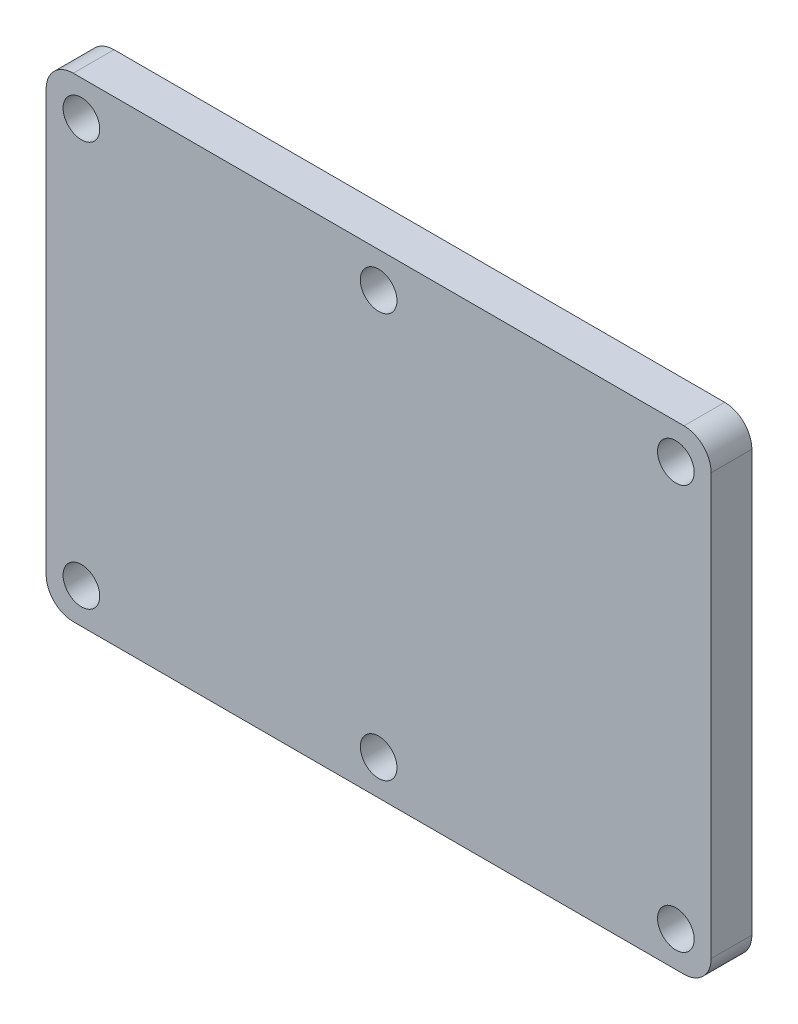
ISO-10303-21;
HEADER;
FILE_DESCRIPTION(('STEP AP214'),'2;1');
FILE_NAME('part.step','',(''),(''),'','','');
FILE_SCHEMA(('AUTOMOTIVE_DESIGN { 1 0 10303 214 1 1 1 1 }'));
ENDSEC;
DATA;
#1=APPLICATION_CONTEXT('core data for automotive mechanical design processes');
#2=APPLICATION_PROTOCOL_DEFINITION('international standard','automotive_design',2000,#1);
#3=PRODUCT_CONTEXT('',#1,'mechanical');
#4=PRODUCT('Part','Part','',(#3));
#5=PRODUCT_RELATED_PRODUCT_CATEGORY('part','',(#4));
#6=PRODUCT_DEFINITION_FORMATION('','',#4);
#7=PRODUCT_DEFINITION_CONTEXT('part definition',#1,'design');
#8=PRODUCT_DEFINITION('design','',#6,#7);
#9=PRODUCT_DEFINITION_SHAPE('','',#8);
#10=(LENGTH_UNIT() NAMED_UNIT(*) SI_UNIT(.MILLI.,.METRE.));
#11=(NAMED_UNIT(*) PLANE_ANGLE_UNIT() SI_UNIT($,.RADIAN.));
#12=(NAMED_UNIT(*) SI_UNIT($,.STERADIAN.) SOLID_ANGLE_UNIT());
#13=UNCERTAINTY_MEASURE_WITH_UNIT(LENGTH_MEASURE(1.E-05),#10,'distance_accuracy_value','');
#14=(GEOMETRIC_REPRESENTATION_CONTEXT(3) GLOBAL_UNCERTAINTY_ASSIGNED_CONTEXT((#13)) GLOBAL_UNIT_ASSIGNED_CONTEXT((#10,
#11,#12)) REPRESENTATION_CONTEXT('',''));
#15=CARTESIAN_POINT('',(0.,0.,0.));
#16=DIRECTION('',(0.,0.,1.));
#17=DIRECTION('',(1.,0.,0.));
#18=AXIS2_PLACEMENT_3D('',#15,#16,#17);
#19=CARTESIAN_POINT('',(0.,0.,0.));
#20=DIRECTION('',(0.,0.,1.));
#21=DIRECTION('',(1.,0.,0.));
#22=AXIS2_PLACEMENT_3D('',#19,#20,#21);
#23=PLANE('',#22);
#24=CARTESIAN_POINT('',(21.9,14.9,0.));
#25=DIRECTION('',(0.,0.,1.));
#26=DIRECTION('',(1.,0.,0.));
#27=AXIS2_PLACEMENT_3D('',#24,#25,#26);
#28=CIRCLE('',#27,1.35);
#29=CARTESIAN_POINT('',(23.25,14.9,0.));
#30=VERTEX_POINT('',#29);
#31=EDGE_CURVE('E265',#30,#30,#28,.T.);
#32=ORIENTED_EDGE('',*,*,#31,.T.);
#33=EDGE_LOOP('',(#32));
#34=FACE_BOUND('',#33,.T.);
#35=CARTESIAN_POINT('',(0.,14.9,0.));
#36=DIRECTION('',(0.,0.,1.));
#37=DIRECTION('',(1.,0.,0.));
#38=AXIS2_PLACEMENT_3D('',#35,#36,#37);
#39=CIRCLE('',#38,1.35);
#40=CARTESIAN_POINT('',(1.35,14.9,0.));
#41=VERTEX_POINT('',#40);
#42=EDGE_CURVE('E301',#41,#41,#39,.T.);
#43=ORIENTED_EDGE('',*,*,#42,.T.);
#44=EDGE_LOOP('',(#43));
#45=FACE_BOUND('',#44,.T.);
#46=CARTESIAN_POINT('',(-21.9,14.9,0.));
#47=DIRECTION('',(0.,0.,1.));
#48=DIRECTION('',(1.,0.,0.));
#49=AXIS2_PLACEMENT_3D('',#46,#47,#48);
#50=CIRCLE('',#49,1.35);
#51=CARTESIAN_POINT('',(-20.55,14.9,0.));
#52=VERTEX_POINT('',#51);
#53=EDGE_CURVE('E293',#52,#52,#50,.T.);
#54=ORIENTED_EDGE('',*,*,#53,.T.);
#55=EDGE_LOOP('',(#54));
#56=FACE_BOUND('',#55,.T.);
#57=CARTESIAN_POINT('',(-21.9,-14.9,0.));
#58=DIRECTION('',(0.,0.,-1.));
#59=DIRECTION('',(-1.,0.,0.));
#60=AXIS2_PLACEMENT_3D('',#57,#58,#59);
#61=CIRCLE('',#60,1.35000000000001);
#62=CARTESIAN_POINT('',(-23.25,-14.9,0.));
#63=VERTEX_POINT('',#62);
#64=EDGE_CURVE('E256',#63,#63,#61,.T.);
#65=ORIENTED_EDGE('',*,*,#64,.F.);
#66=EDGE_LOOP('',(#65));
#67=FACE_BOUND('',#66,.T.);
#68=CARTESIAN_POINT('',(0.,-14.9,0.));
#69=DIRECTION('',(0.,0.,-1.));
#70=DIRECTION('',(-1.,0.,0.));
#71=AXIS2_PLACEMENT_3D('',#68,#69,#70);
#72=CIRCLE('',#71,1.35);
#73=CARTESIAN_POINT('',(-1.35,-14.9,0.));
#74=VERTEX_POINT('',#73);
#75=EDGE_CURVE('E263',#74,#74,#72,.T.);
#76=ORIENTED_EDGE('',*,*,#75,.F.);
#77=EDGE_LOOP('',(#76));
#78=FACE_BOUND('',#77,.T.);
#79=CARTESIAN_POINT('',(21.9,-14.9,0.));
#80=DIRECTION('',(0.,0.,-1.));
#81=DIRECTION('',(-1.,0.,0.));
#82=AXIS2_PLACEMENT_3D('',#79,#80,#81);
#83=CIRCLE('',#82,1.35000000000001);
#84=CARTESIAN_POINT('',(20.55,-14.9,0.));
#85=VERTEX_POINT('',#84);
#86=EDGE_CURVE('E138',#85,#85,#83,.T.);
#87=ORIENTED_EDGE('',*,*,#86,.F.);
#88=EDGE_LOOP('',(#87));
#89=FACE_BOUND('',#88,.T.);
#90=DIRECTION('',(-1.,0.,0.));
#91=VECTOR('',#90,1.);
#92=CARTESIAN_POINT('',(-24.5,17.5,0.));
#93=LINE('',#92,#91);
#94=CARTESIAN_POINT('',(22.5,17.5,0.));
#95=VERTEX_POINT('',#94);
#96=CARTESIAN_POINT('',(-22.5,17.5,0.));
#97=VERTEX_POINT('',#96);
#98=EDGE_CURVE('E259',#95,#97,#93,.T.);
#99=ORIENTED_EDGE('',*,*,#98,.F.);
#100=CARTESIAN_POINT('',(22.5,15.5,0.));
#101=DIRECTION('',(0.,0.,1.));
#102=DIRECTION('',(1.,0.,0.));
#103=AXIS2_PLACEMENT_3D('',#100,#101,#102);
#104=CIRCLE('',#103,2.);
#105=CARTESIAN_POINT('',(24.5,15.5,0.));
#106=VERTEX_POINT('',#105);
#107=EDGE_CURVE('E128',#95,#106,#104,.F.);
#108=ORIENTED_EDGE('',*,*,#107,.T.);
#109=DIRECTION('',(0.,1.,0.));
#110=VECTOR('',#109,1.);
#111=CARTESIAN_POINT('',(24.5,17.5,0.));
#112=LINE('',#111,#110);
#113=CARTESIAN_POINT('',(24.5,-15.5,0.));
#114=VERTEX_POINT('',#113);
#115=EDGE_CURVE('E122',#114,#106,#112,.T.);
#116=ORIENTED_EDGE('',*,*,#115,.F.);
#117=CARTESIAN_POINT('',(22.5,-15.5,0.));
#118=DIRECTION('',(0.,0.,1.));
#119=DIRECTION('',(1.,0.,0.));
#120=AXIS2_PLACEMENT_3D('',#117,#118,#119);
#121=CIRCLE('',#120,2.);
#122=CARTESIAN_POINT('',(22.5,-17.5,0.));
#123=VERTEX_POINT('',#122);
#124=EDGE_CURVE('E107',#114,#123,#121,.F.);
#125=ORIENTED_EDGE('',*,*,#124,.T.);
#126=DIRECTION('',(1.,0.,0.));
#127=VECTOR('',#126,1.);
#128=CARTESIAN_POINT('',(-24.5,-17.5,0.));
#129=LINE('',#128,#127);
#130=CARTESIAN_POINT('',(-22.5,-17.5,0.));
#131=VERTEX_POINT('',#130);
#132=EDGE_CURVE('E135',#131,#123,#129,.T.);
#133=ORIENTED_EDGE('',*,*,#132,.F.);
#134=CARTESIAN_POINT('',(-22.5,-15.5,0.));
#135=DIRECTION('',(0.,0.,1.));
#136=DIRECTION('',(1.,0.,0.));
#137=AXIS2_PLACEMENT_3D('',#134,#135,#136);
#138=CIRCLE('',#137,2.);
#139=CARTESIAN_POINT('',(-24.5,-15.5,0.));
#140=VERTEX_POINT('',#139);
#141=EDGE_CURVE('E119',#131,#140,#138,.F.);
#142=ORIENTED_EDGE('',*,*,#141,.T.);
#143=DIRECTION('',(0.,-1.,0.));
#144=VECTOR('',#143,1.);
#145=CARTESIAN_POINT('',(-24.5,17.5,0.));
#146=LINE('',#145,#144);
#147=CARTESIAN_POINT('',(-24.5,15.5,0.));
#148=VERTEX_POINT('',#147);
#149=EDGE_CURVE('E130',#148,#140,#146,.T.);
#150=ORIENTED_EDGE('',*,*,#149,.F.);
#151=CARTESIAN_POINT('',(-22.5,15.5,0.));
#152=DIRECTION('',(0.,0.,1.));
#153=DIRECTION('',(1.,0.,0.));
#154=AXIS2_PLACEMENT_3D('',#151,#152,#153);
#155=CIRCLE('',#154,2.);
#156=EDGE_CURVE('E170',#148,#97,#155,.F.);
#157=ORIENTED_EDGE('',*,*,#156,.T.);
#158=EDGE_LOOP('',(#99,#108,#116,#125,#133,#142,#150,#157));
#159=FACE_BOUND('',#158,.T.);
#160=ADVANCED_FACE('F38',(#34,#45,#56,#67,#78,#89,#159),#23,.F.);
#161=CARTESIAN_POINT('',(24.5,17.5,3.));
#162=DIRECTION('',(-1.,0.,0.));
#163=DIRECTION('',(0.,0.,1.));
#164=AXIS2_PLACEMENT_3D('',#161,#162,#163);
#165=PLANE('',#164);
#166=ORIENTED_EDGE('',*,*,#115,.T.);
#167=DIRECTION('',(0.,0.,-1.));
#168=VECTOR('',#167,1.);
#169=CARTESIAN_POINT('',(24.5,15.5,3.));
#170=LINE('',#169,#168);
#171=CARTESIAN_POINT('',(24.5,15.5,3.));
#172=VERTEX_POINT('',#171);
#173=EDGE_CURVE('E62',#106,#172,#170,.F.);
#174=ORIENTED_EDGE('',*,*,#173,.T.);
#175=DIRECTION('',(0.,1.,0.));
#176=VECTOR('',#175,1.);
#177=CARTESIAN_POINT('',(24.5,17.5,3.));
#178=LINE('',#177,#176);
#179=CARTESIAN_POINT('',(24.5,-15.5,3.));
#180=VERTEX_POINT('',#179);
#181=EDGE_CURVE('E123',#180,#172,#178,.T.);
#182=ORIENTED_EDGE('',*,*,#181,.F.);
#183=DIRECTION('',(0.,0.,-1.));
#184=VECTOR('',#183,1.);
#185=CARTESIAN_POINT('',(24.5,-15.5,3.));
#186=LINE('',#185,#184);
#187=EDGE_CURVE('E111',#180,#114,#186,.T.);
#188=ORIENTED_EDGE('',*,*,#187,.T.);
#189=EDGE_LOOP('',(#166,#174,#182,#188));
#190=FACE_BOUND('',#189,.T.);
#191=ADVANCED_FACE('F121',(#190),#165,.F.);
#192=CARTESIAN_POINT('',(-24.5,17.5,3.));
#193=DIRECTION('',(0.,-1.,0.));
#194=DIRECTION('',(0.,0.,-1.));
#195=AXIS2_PLACEMENT_3D('',#192,#193,#194);
#196=PLANE('',#195);
#197=DIRECTION('',(-1.,0.,0.));
#198=VECTOR('',#197,1.);
#199=CARTESIAN_POINT('',(-24.5,17.5,3.));
#200=LINE('',#199,#198);
#201=CARTESIAN_POINT('',(22.5,17.5,3.));
#202=VERTEX_POINT('',#201);
#203=CARTESIAN_POINT('',(-22.5,17.5,3.));
#204=VERTEX_POINT('',#203);
#205=EDGE_CURVE('E182',#202,#204,#200,.T.);
#206=ORIENTED_EDGE('',*,*,#205,.F.);
#207=DIRECTION('',(0.,0.,-1.));
#208=VECTOR('',#207,1.);
#209=CARTESIAN_POINT('',(22.5,17.5,3.));
#210=LINE('',#209,#208);
#211=EDGE_CURVE('E166',#202,#95,#210,.T.);
#212=ORIENTED_EDGE('',*,*,#211,.T.);
#213=ORIENTED_EDGE('',*,*,#98,.T.);
#214=DIRECTION('',(0.,0.,-1.));
#215=VECTOR('',#214,1.);
#216=CARTESIAN_POINT('',(-22.5,17.5,3.));
#217=LINE('',#216,#215);
#218=EDGE_CURVE('E163',#97,#204,#217,.F.);
#219=ORIENTED_EDGE('',*,*,#218,.T.);
#220=EDGE_LOOP('',(#206,#212,#213,#219));
#221=FACE_BOUND('',#220,.T.);
#222=ADVANCED_FACE('F186',(#221),#196,.F.);
#223=CARTESIAN_POINT('',(-24.5,17.5,3.));
#224=DIRECTION('',(1.,0.,0.));
#225=DIRECTION('',(0.,0.,-1.));
#226=AXIS2_PLACEMENT_3D('',#223,#224,#225);
#227=PLANE('',#226);
#228=DIRECTION('',(0.,-1.,0.));
#229=VECTOR('',#228,1.);
#230=CARTESIAN_POINT('',(-24.5,17.5,3.));
#231=LINE('',#230,#229);
#232=CARTESIAN_POINT('',(-24.5,15.5,3.));
#233=VERTEX_POINT('',#232);
#234=CARTESIAN_POINT('',(-24.5,-15.5,3.));
#235=VERTEX_POINT('',#234);
#236=EDGE_CURVE('E190',#233,#235,#231,.T.);
#237=ORIENTED_EDGE('',*,*,#236,.F.);
#238=DIRECTION('',(0.,0.,-1.));
#239=VECTOR('',#238,1.);
#240=CARTESIAN_POINT('',(-24.5,15.5,3.));
#241=LINE('',#240,#239);
#242=EDGE_CURVE('E11',#233,#148,#241,.T.);
#243=ORIENTED_EDGE('',*,*,#242,.T.);
#244=ORIENTED_EDGE('',*,*,#149,.T.);
#245=DIRECTION('',(0.,0.,-1.));
#246=VECTOR('',#245,1.);
#247=CARTESIAN_POINT('',(-24.5,-15.5,3.));
#248=LINE('',#247,#246);
#249=EDGE_CURVE('E159',#140,#235,#248,.F.);
#250=ORIENTED_EDGE('',*,*,#249,.T.);
#251=EDGE_LOOP('',(#237,#243,#244,#250));
#252=FACE_BOUND('',#251,.T.);
#253=ADVANCED_FACE('F218',(#252),#227,.F.);
#254=CARTESIAN_POINT('',(-24.5,-17.5,3.));
#255=DIRECTION('',(0.,1.,0.));
#256=DIRECTION('',(0.,0.,1.));
#257=AXIS2_PLACEMENT_3D('',#254,#255,#256);
#258=PLANE('',#257);
#259=ORIENTED_EDGE('',*,*,#132,.T.);
#260=DIRECTION('',(0.,0.,-1.));
#261=VECTOR('',#260,1.);
#262=CARTESIAN_POINT('',(22.5,-17.5,3.));
#263=LINE('',#262,#261);
#264=CARTESIAN_POINT('',(22.5,-17.5,3.));
#265=VERTEX_POINT('',#264);
#266=EDGE_CURVE('E112',#123,#265,#263,.F.);
#267=ORIENTED_EDGE('',*,*,#266,.T.);
#268=DIRECTION('',(1.,0.,0.));
#269=VECTOR('',#268,1.);
#270=CARTESIAN_POINT('',(-24.5,-17.5,3.));
#271=LINE('',#270,#269);
#272=CARTESIAN_POINT('',(-22.5,-17.5,3.));
#273=VERTEX_POINT('',#272);
#274=EDGE_CURVE('E125',#273,#265,#271,.T.);
#275=ORIENTED_EDGE('',*,*,#274,.F.);
#276=DIRECTION('',(0.,0.,-1.));
#277=VECTOR('',#276,1.);
#278=CARTESIAN_POINT('',(-22.5,-17.5,3.));
#279=LINE('',#278,#277);
#280=EDGE_CURVE('E118',#273,#131,#279,.T.);
#281=ORIENTED_EDGE('',*,*,#280,.T.);
#282=EDGE_LOOP('',(#259,#267,#275,#281));
#283=FACE_BOUND('',#282,.T.);
#284=ADVANCED_FACE('F215',(#283),#258,.F.);
#285=CARTESIAN_POINT('',(0.,0.,3.));
#286=DIRECTION('',(0.,0.,1.));
#287=DIRECTION('',(1.,0.,0.));
#288=AXIS2_PLACEMENT_3D('',#285,#286,#287);
#289=PLANE('',#288);
#290=CARTESIAN_POINT('',(21.9,14.9,3.));
#291=DIRECTION('',(0.,0.,1.));
#292=DIRECTION('',(1.,0.,0.));
#293=AXIS2_PLACEMENT_3D('',#290,#291,#292);
#294=CIRCLE('',#293,1.35);
#295=CARTESIAN_POINT('',(23.25,14.9,3.));
#296=VERTEX_POINT('',#295);
#297=EDGE_CURVE('E305',#296,#296,#294,.T.);
#298=ORIENTED_EDGE('',*,*,#297,.F.);
#299=EDGE_LOOP('',(#298));
#300=FACE_BOUND('',#299,.T.);
#301=CARTESIAN_POINT('',(0.,14.9,3.));
#302=DIRECTION('',(0.,0.,1.));
#303=DIRECTION('',(1.,0.,0.));
#304=AXIS2_PLACEMENT_3D('',#301,#302,#303);
#305=CIRCLE('',#304,1.35);
#306=CARTESIAN_POINT('',(1.35,14.9,3.));
#307=VERTEX_POINT('',#306);
#308=EDGE_CURVE('E297',#307,#307,#305,.T.);
#309=ORIENTED_EDGE('',*,*,#308,.F.);
#310=EDGE_LOOP('',(#309));
#311=FACE_BOUND('',#310,.T.);
#312=CARTESIAN_POINT('',(-21.9,14.9,3.));
#313=DIRECTION('',(0.,0.,1.));
#314=DIRECTION('',(1.,0.,0.));
#315=AXIS2_PLACEMENT_3D('',#312,#313,#314);
#316=CIRCLE('',#315,1.35);
#317=CARTESIAN_POINT('',(-20.55,14.9,3.));
#318=VERTEX_POINT('',#317);
#319=EDGE_CURVE('E289',#318,#318,#316,.T.);
#320=ORIENTED_EDGE('',*,*,#319,.F.);
#321=EDGE_LOOP('',(#320));
#322=FACE_BOUND('',#321,.T.);
#323=CARTESIAN_POINT('',(21.9,-14.9,3.));
#324=DIRECTION('',(0.,0.,-1.));
#325=DIRECTION('',(-1.,0.,0.));
#326=AXIS2_PLACEMENT_3D('',#323,#324,#325);
#327=CIRCLE('',#326,1.35000000000001);
#328=CARTESIAN_POINT('',(20.55,-14.9,3.));
#329=VERTEX_POINT('',#328);
#330=EDGE_CURVE('E131',#329,#329,#327,.T.);
#331=ORIENTED_EDGE('',*,*,#330,.T.);
#332=EDGE_LOOP('',(#331));
#333=FACE_BOUND('',#332,.T.);
#334=CARTESIAN_POINT('',(0.,-14.9,3.));
#335=DIRECTION('',(0.,0.,-1.));
#336=DIRECTION('',(-1.,0.,0.));
#337=AXIS2_PLACEMENT_3D('',#334,#335,#336);
#338=CIRCLE('',#337,1.35);
#339=CARTESIAN_POINT('',(-1.35,-14.9,3.));
#340=VERTEX_POINT('',#339);
#341=EDGE_CURVE('E282',#340,#340,#338,.T.);
#342=ORIENTED_EDGE('',*,*,#341,.T.);
#343=EDGE_LOOP('',(#342));
#344=FACE_BOUND('',#343,.T.);
#345=CARTESIAN_POINT('',(-21.9,-14.9,3.));
#346=DIRECTION('',(0.,0.,-1.));
#347=DIRECTION('',(-1.,0.,0.));
#348=AXIS2_PLACEMENT_3D('',#345,#346,#347);
#349=CIRCLE('',#348,1.35000000000001);
#350=CARTESIAN_POINT('',(-23.25,-14.9,3.));
#351=VERTEX_POINT('',#350);
#352=EDGE_CURVE('E253',#351,#351,#349,.T.);
#353=ORIENTED_EDGE('',*,*,#352,.T.);
#354=EDGE_LOOP('',(#353));
#355=FACE_BOUND('',#354,.T.);
#356=ORIENTED_EDGE('',*,*,#181,.T.);
#357=CARTESIAN_POINT('',(22.5,15.5,3.));
#358=DIRECTION('',(0.,0.,1.));
#359=DIRECTION('',(1.,0.,0.));
#360=AXIS2_PLACEMENT_3D('',#357,#358,#359);
#361=CIRCLE('',#360,2.);
#362=EDGE_CURVE('E47',#172,#202,#361,.T.);
#363=ORIENTED_EDGE('',*,*,#362,.T.);
#364=ORIENTED_EDGE('',*,*,#205,.T.);
#365=CARTESIAN_POINT('',(-22.5,15.5,3.));
#366=DIRECTION('',(0.,0.,1.));
#367=DIRECTION('',(1.,0.,0.));
#368=AXIS2_PLACEMENT_3D('',#365,#366,#367);
#369=CIRCLE('',#368,2.);
#370=EDGE_CURVE('E54',#204,#233,#369,.T.);
#371=ORIENTED_EDGE('',*,*,#370,.T.);
#372=ORIENTED_EDGE('',*,*,#236,.T.);
#373=CARTESIAN_POINT('',(-22.5,-15.5,3.));
#374=DIRECTION('',(0.,0.,1.));
#375=DIRECTION('',(1.,0.,0.));
#376=AXIS2_PLACEMENT_3D('',#373,#374,#375);
#377=CIRCLE('',#376,2.);
#378=EDGE_CURVE('E153',#235,#273,#377,.T.);
#379=ORIENTED_EDGE('',*,*,#378,.T.);
#380=ORIENTED_EDGE('',*,*,#274,.T.);
#381=CARTESIAN_POINT('',(22.5,-15.5,3.));
#382=DIRECTION('',(0.,0.,1.));
#383=DIRECTION('',(1.,0.,0.));
#384=AXIS2_PLACEMENT_3D('',#381,#382,#383);
#385=CIRCLE('',#384,2.);
#386=EDGE_CURVE('E156',#265,#180,#385,.T.);
#387=ORIENTED_EDGE('',*,*,#386,.T.);
#388=EDGE_LOOP('',(#356,#363,#364,#371,#372,#379,#380,#387));
#389=FACE_BOUND('',#388,.T.);
#390=ADVANCED_FACE('F181',(#300,#311,#322,#333,#344,#355,#389),#289,.T.);
#391=CARTESIAN_POINT('',(-21.9,-14.9,3.));
#392=DIRECTION('',(0.,0.,-1.));
#393=DIRECTION('',(-1.,0.,0.));
#394=AXIS2_PLACEMENT_3D('',#391,#392,#393);
#395=CYLINDRICAL_SURFACE('',#394,1.35000000000001);
#396=ORIENTED_EDGE('',*,*,#352,.F.);
#397=EDGE_LOOP('',(#396));
#398=FACE_BOUND('',#397,.T.);
#399=ORIENTED_EDGE('',*,*,#64,.T.);
#400=EDGE_LOOP('',(#399));
#401=FACE_BOUND('',#400,.T.);
#402=ADVANCED_FACE('F236',(#398,#401),#395,.F.);
#403=CARTESIAN_POINT('',(0.,-14.9,3.));
#404=DIRECTION('',(0.,0.,-1.));
#405=DIRECTION('',(-1.,0.,0.));
#406=AXIS2_PLACEMENT_3D('',#403,#404,#405);
#407=CYLINDRICAL_SURFACE('',#406,1.35);
#408=ORIENTED_EDGE('',*,*,#341,.F.);
#409=EDGE_LOOP('',(#408));
#410=FACE_BOUND('',#409,.T.);
#411=ORIENTED_EDGE('',*,*,#75,.T.);
#412=EDGE_LOOP('',(#411));
#413=FACE_BOUND('',#412,.T.);
#414=ADVANCED_FACE('F230',(#410,#413),#407,.F.);
#415=CARTESIAN_POINT('',(21.9,-14.9,3.));
#416=DIRECTION('',(0.,0.,-1.));
#417=DIRECTION('',(-1.,0.,0.));
#418=AXIS2_PLACEMENT_3D('',#415,#416,#417);
#419=CYLINDRICAL_SURFACE('',#418,1.35000000000001);
#420=ORIENTED_EDGE('',*,*,#330,.F.);
#421=EDGE_LOOP('',(#420));
#422=FACE_BOUND('',#421,.T.);
#423=ORIENTED_EDGE('',*,*,#86,.T.);
#424=EDGE_LOOP('',(#423));
#425=FACE_BOUND('',#424,.T.);
#426=ADVANCED_FACE('F226',(#422,#425),#419,.F.);
#427=CARTESIAN_POINT('',(22.5,-15.5,3.));
#428=DIRECTION('',(0.,0.,-1.));
#429=DIRECTION('',(-1.,0.,0.));
#430=AXIS2_PLACEMENT_3D('',#427,#428,#429);
#431=CYLINDRICAL_SURFACE('',#430,2.);
#432=ORIENTED_EDGE('',*,*,#386,.F.);
#433=ORIENTED_EDGE('',*,*,#266,.F.);
#434=ORIENTED_EDGE('',*,*,#124,.F.);
#435=ORIENTED_EDGE('',*,*,#187,.F.);
#436=EDGE_LOOP('',(#432,#433,#434,#435));
#437=FACE_BOUND('',#436,.T.);
#438=ADVANCED_FACE('F110',(#437),#431,.T.);
#439=CARTESIAN_POINT('',(-22.5,-15.5,3.));
#440=DIRECTION('',(0.,0.,-1.));
#441=DIRECTION('',(-1.,0.,0.));
#442=AXIS2_PLACEMENT_3D('',#439,#440,#441);
#443=CYLINDRICAL_SURFACE('',#442,2.);
#444=ORIENTED_EDGE('',*,*,#378,.F.);
#445=ORIENTED_EDGE('',*,*,#249,.F.);
#446=ORIENTED_EDGE('',*,*,#141,.F.);
#447=ORIENTED_EDGE('',*,*,#280,.F.);
#448=EDGE_LOOP('',(#444,#445,#446,#447));
#449=FACE_BOUND('',#448,.T.);
#450=ADVANCED_FACE('F194',(#449),#443,.T.);
#451=CARTESIAN_POINT('',(22.5,15.5,3.));
#452=DIRECTION('',(0.,0.,-1.));
#453=DIRECTION('',(-1.,0.,0.));
#454=AXIS2_PLACEMENT_3D('',#451,#452,#453);
#455=CYLINDRICAL_SURFACE('',#454,2.);
#456=ORIENTED_EDGE('',*,*,#362,.F.);
#457=ORIENTED_EDGE('',*,*,#173,.F.);
#458=ORIENTED_EDGE('',*,*,#107,.F.);
#459=ORIENTED_EDGE('',*,*,#211,.F.);
#460=EDGE_LOOP('',(#456,#457,#458,#459));
#461=FACE_BOUND('',#460,.T.);
#462=ADVANCED_FACE('F192',(#461),#455,.T.);
#463=CARTESIAN_POINT('',(-22.5,15.5,3.));
#464=DIRECTION('',(0.,0.,-1.));
#465=DIRECTION('',(-1.,0.,0.));
#466=AXIS2_PLACEMENT_3D('',#463,#464,#465);
#467=CYLINDRICAL_SURFACE('',#466,2.);
#468=ORIENTED_EDGE('',*,*,#370,.F.);
#469=ORIENTED_EDGE('',*,*,#218,.F.);
#470=ORIENTED_EDGE('',*,*,#156,.F.);
#471=ORIENTED_EDGE('',*,*,#242,.F.);
#472=EDGE_LOOP('',(#468,#469,#470,#471));
#473=FACE_BOUND('',#472,.T.);
#474=ADVANCED_FACE('F40',(#473),#467,.T.);
#475=CARTESIAN_POINT('',(-21.9,14.9,0.));
#476=DIRECTION('',(0.,0.,1.));
#477=DIRECTION('',(1.,0.,0.));
#478=AXIS2_PLACEMENT_3D('',#475,#476,#477);
#479=CYLINDRICAL_SURFACE('',#478,1.35);
#480=ORIENTED_EDGE('',*,*,#53,.F.);
#481=EDGE_LOOP('',(#480));
#482=FACE_BOUND('',#481,.T.);
#483=ORIENTED_EDGE('',*,*,#319,.T.);
#484=EDGE_LOOP('',(#483));
#485=FACE_BOUND('',#484,.T.);
#486=ADVANCED_FACE('F199',(#482,#485),#479,.F.);
#487=CARTESIAN_POINT('',(0.,14.9,0.));
#488=DIRECTION('',(0.,0.,1.));
#489=DIRECTION('',(1.,0.,0.));
#490=AXIS2_PLACEMENT_3D('',#487,#488,#489);
#491=CYLINDRICAL_SURFACE('',#490,1.35);
#492=ORIENTED_EDGE('',*,*,#42,.F.);
#493=EDGE_LOOP('',(#492));
#494=FACE_BOUND('',#493,.T.);
#495=ORIENTED_EDGE('',*,*,#308,.T.);
#496=EDGE_LOOP('',(#495));
#497=FACE_BOUND('',#496,.T.);
#498=ADVANCED_FACE('F315',(#494,#497),#491,.F.);
#499=CARTESIAN_POINT('',(21.9,14.9,0.));
#500=DIRECTION('',(0.,0.,1.));
#501=DIRECTION('',(1.,0.,0.));
#502=AXIS2_PLACEMENT_3D('',#499,#500,#501);
#503=CYLINDRICAL_SURFACE('',#502,1.35);
#504=ORIENTED_EDGE('',*,*,#31,.F.);
#505=EDGE_LOOP('',(#504));
#506=FACE_BOUND('',#505,.T.);
#507=ORIENTED_EDGE('',*,*,#297,.T.);
#508=EDGE_LOOP('',(#507));
#509=FACE_BOUND('',#508,.T.);
#510=ADVANCED_FACE('F312',(#506,#509),#503,.F.);
#511=CLOSED_SHELL('',(#160,#191,#222,#253,#284,#390,#402,#414,#426,#438,#450,#462,#474,#486,
#498,#510));
#512=MANIFOLD_SOLID_BREP('B2',#511);
#513=ADVANCED_BREP_SHAPE_REPRESENTATION('',(#18,#512),#14);
#514=SHAPE_DEFINITION_REPRESENTATION(#9,#513);
ENDSEC;
END-ISO-10303-21;
